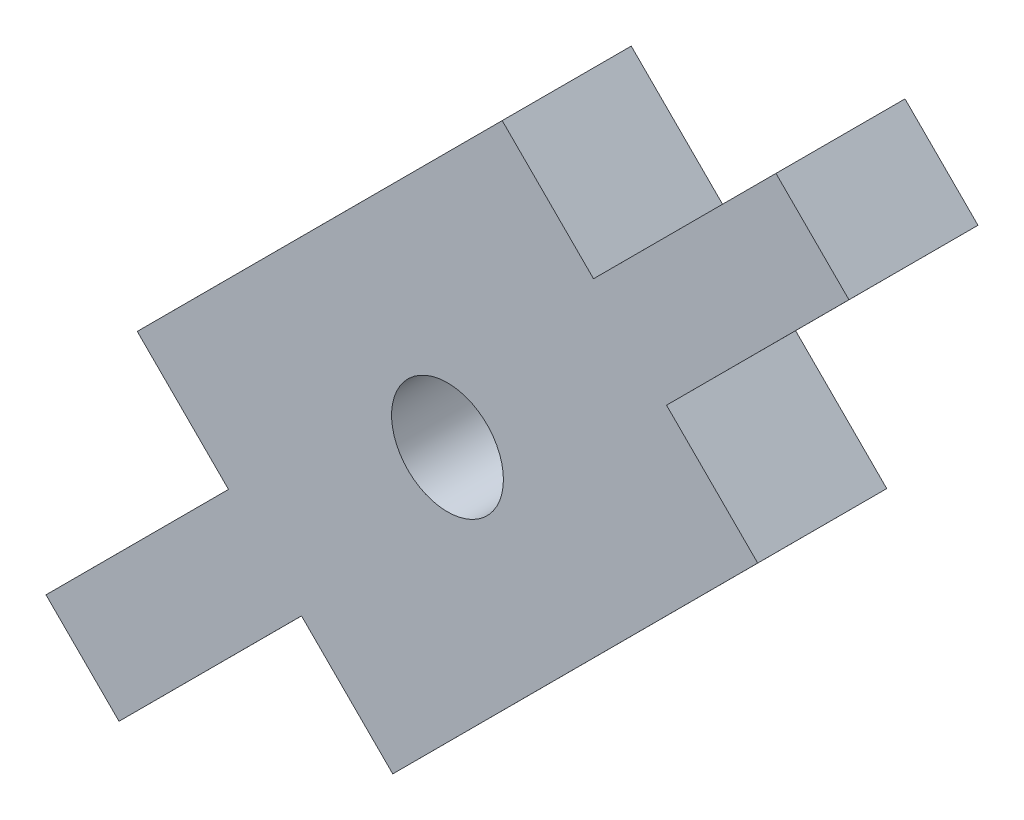
ISO-10303-21;
HEADER;
FILE_DESCRIPTION(('STEP AP214'),'2;1');
FILE_NAME('part.step','',(''),(''),'','','');
FILE_SCHEMA(('AUTOMOTIVE_DESIGN { 1 0 10303 214 1 1 1 1 }'));
ENDSEC;
DATA;
#1=APPLICATION_CONTEXT('core data for automotive mechanical design processes');
#2=APPLICATION_PROTOCOL_DEFINITION('international standard','automotive_design',2000,#1);
#3=PRODUCT_CONTEXT('',#1,'mechanical');
#4=PRODUCT('Part','Part','',(#3));
#5=PRODUCT_RELATED_PRODUCT_CATEGORY('part','',(#4));
#6=PRODUCT_DEFINITION_FORMATION('','',#4);
#7=PRODUCT_DEFINITION_CONTEXT('part definition',#1,'design');
#8=PRODUCT_DEFINITION('design','',#6,#7);
#9=PRODUCT_DEFINITION_SHAPE('','',#8);
#10=(LENGTH_UNIT() NAMED_UNIT(*) SI_UNIT(.MILLI.,.METRE.));
#11=(NAMED_UNIT(*) PLANE_ANGLE_UNIT() SI_UNIT($,.RADIAN.));
#12=(NAMED_UNIT(*) SI_UNIT($,.STERADIAN.) SOLID_ANGLE_UNIT());
#13=UNCERTAINTY_MEASURE_WITH_UNIT(LENGTH_MEASURE(1.E-05),#10,'distance_accuracy_value','');
#14=(GEOMETRIC_REPRESENTATION_CONTEXT(3) GLOBAL_UNCERTAINTY_ASSIGNED_CONTEXT((#13)) GLOBAL_UNIT_ASSIGNED_CONTEXT((#10,
#11,#12)) REPRESENTATION_CONTEXT('',''));
#15=CARTESIAN_POINT('',(0.,0.,0.));
#16=DIRECTION('',(0.,0.,1.));
#17=DIRECTION('',(1.,0.,0.));
#18=AXIS2_PLACEMENT_3D('',#15,#16,#17);
#19=CARTESIAN_POINT('',(11.1732462274372,31.927912313794,-3.36285766749983));
#20=DIRECTION('',(-0.707207961814516,0.707005586078468,0.));
#21=DIRECTION('',(-0.707005586078468,-0.707207961814516,0.));
#22=AXIS2_PLACEMENT_3D('',#19,#20,#21);
#23=PLANE('',#22);
#24=DIRECTION('',(-0.707005586078468,-0.707207961814516,0.));
#25=VECTOR('',#24,1.);
#26=CARTESIAN_POINT('',(11.1732462274372,31.927912313794,-0.36285766749983));
#27=LINE('',#26,#25);
#28=CARTESIAN_POINT('',(11.1732462274372,31.927912313794,-0.36285766749983));
#29=VERTEX_POINT('',#28);
#30=CARTESIAN_POINT('',(6.93196836559376,27.6854204138355,-0.36285766749983));
#31=VERTEX_POINT('',#30);
#32=EDGE_CURVE('E158',#29,#31,#27,.T.);
#33=ORIENTED_EDGE('',*,*,#32,.F.);
#34=DIRECTION('',(0.,0.,1.));
#35=VECTOR('',#34,1.);
#36=CARTESIAN_POINT('',(11.1732462274372,31.927912313794,-3.36285766749983));
#37=LINE('',#36,#35);
#38=CARTESIAN_POINT('',(11.1732462274372,31.927912313794,-3.36285766749983));
#39=VERTEX_POINT('',#38);
#40=EDGE_CURVE('E11',#39,#29,#37,.T.);
#41=ORIENTED_EDGE('',*,*,#40,.F.);
#42=DIRECTION('',(-0.707005586078468,-0.707207961814516,0.));
#43=VECTOR('',#42,1.);
#44=CARTESIAN_POINT('',(11.1732462274372,31.927912313794,-3.36285766749983));
#45=LINE('',#44,#43);
#46=CARTESIAN_POINT('',(6.93196836559376,27.6854204138355,-3.36285766749983));
#47=VERTEX_POINT('',#46);
#48=EDGE_CURVE('E191',#39,#47,#45,.T.);
#49=ORIENTED_EDGE('',*,*,#48,.T.);
#50=DIRECTION('',(0.,0.,1.));
#51=VECTOR('',#50,1.);
#52=CARTESIAN_POINT('',(6.93196836559376,27.6854204138355,-3.36285766749983));
#53=LINE('',#52,#51);
#54=EDGE_CURVE('E40',#47,#31,#53,.T.);
#55=ORIENTED_EDGE('',*,*,#54,.T.);
#56=EDGE_LOOP('',(#33,#41,#49,#55));
#57=FACE_BOUND('',#56,.T.);
#58=ADVANCED_FACE('F37',(#57),#23,.T.);
#59=CARTESIAN_POINT('',(12.8704287908278,30.2312154188192,-3.36285766749983));
#60=DIRECTION('',(0.707005586078475,0.707207961814509,0.));
#61=DIRECTION('',(-0.707207961814509,0.707005586078475,0.));
#62=AXIS2_PLACEMENT_3D('',#59,#60,#61);
#63=PLANE('',#62);
#64=DIRECTION('',(-0.707207961814509,0.707005586078475,0.));
#65=VECTOR('',#64,1.);
#66=CARTESIAN_POINT('',(12.8704287908278,30.2312154188192,-0.36285766749983));
#67=LINE('',#66,#65);
#68=CARTESIAN_POINT('',(12.8704287908278,30.2312154188192,-0.36285766749983));
#69=VERTEX_POINT('',#68);
#70=EDGE_CURVE('E189',#69,#29,#67,.T.);
#71=ORIENTED_EDGE('',*,*,#70,.F.);
#72=DIRECTION('',(0.,0.,1.));
#73=VECTOR('',#72,1.);
#74=CARTESIAN_POINT('',(12.8704287908278,30.2312154188192,-3.36285766749983));
#75=LINE('',#74,#73);
#76=CARTESIAN_POINT('',(12.8704287908278,30.2312154188192,-3.36285766749983));
#77=VERTEX_POINT('',#76);
#78=EDGE_CURVE('E46',#77,#69,#75,.T.);
#79=ORIENTED_EDGE('',*,*,#78,.F.);
#80=DIRECTION('',(-0.707207961814509,0.707005586078475,0.));
#81=VECTOR('',#80,1.);
#82=CARTESIAN_POINT('',(12.8704287908278,30.2312154188192,-3.36285766749983));
#83=LINE('',#82,#81);
#84=EDGE_CURVE('E148',#77,#39,#83,.T.);
#85=ORIENTED_EDGE('',*,*,#84,.T.);
#86=ORIENTED_EDGE('',*,*,#40,.T.);
#87=EDGE_LOOP('',(#71,#79,#85,#86));
#88=FACE_BOUND('',#87,.T.);
#89=ADVANCED_FACE('F211',(#88),#63,.T.);
#90=CARTESIAN_POINT('',(8.62908040068246,25.9886529703706,-3.36285766749983));
#91=DIRECTION('',(0.70720796181451,-0.707005586078474,0.));
#92=DIRECTION('',(0.707005586078474,0.70720796181451,0.));
#93=AXIS2_PLACEMENT_3D('',#90,#91,#92);
#94=PLANE('',#93);
#95=DIRECTION('',(0.707005586078474,0.70720796181451,0.));
#96=VECTOR('',#95,1.);
#97=CARTESIAN_POINT('',(8.62908040068246,25.9886529703706,-0.36285766749983));
#98=LINE('',#97,#96);
#99=CARTESIAN_POINT('',(8.62908040068246,25.9886529703706,-0.36285766749983));
#100=VERTEX_POINT('',#99);
#101=EDGE_CURVE('E135',#100,#69,#98,.T.);
#102=ORIENTED_EDGE('',*,*,#101,.F.);
#103=DIRECTION('',(0.,0.,1.));
#104=VECTOR('',#103,1.);
#105=CARTESIAN_POINT('',(8.62908040068246,25.9886529703706,-3.36285766749983));
#106=LINE('',#105,#104);
#107=CARTESIAN_POINT('',(8.62908040068246,25.9886529703706,-3.36285766749983));
#108=VERTEX_POINT('',#107);
#109=EDGE_CURVE('E130',#108,#100,#106,.T.);
#110=ORIENTED_EDGE('',*,*,#109,.F.);
#111=DIRECTION('',(0.707005586078474,0.70720796181451,0.));
#112=VECTOR('',#111,1.);
#113=CARTESIAN_POINT('',(8.62908040068246,25.9886529703706,-3.36285766749983));
#114=LINE('',#113,#112);
#115=EDGE_CURVE('E133',#108,#77,#114,.T.);
#116=ORIENTED_EDGE('',*,*,#115,.T.);
#117=ORIENTED_EDGE('',*,*,#78,.T.);
#118=EDGE_LOOP('',(#102,#110,#116,#117));
#119=FACE_BOUND('',#118,.T.);
#120=ADVANCED_FACE('F132',(#119),#94,.T.);
#121=CARTESIAN_POINT('',(10.7490725950828,23.869267436251,-3.36285766749983));
#122=DIRECTION('',(0.707005586078495,0.707207961814489,0.));
#123=DIRECTION('',(-0.707207961814489,0.707005586078495,0.));
#124=AXIS2_PLACEMENT_3D('',#121,#122,#123);
#125=PLANE('',#124);
#126=DIRECTION('',(-0.707207961814489,0.707005586078495,0.));
#127=VECTOR('',#126,1.);
#128=CARTESIAN_POINT('',(10.7490725950828,23.869267436251,-0.36285766749983));
#129=LINE('',#128,#127);
#130=CARTESIAN_POINT('',(10.7490725950828,23.869267436251,-0.36285766749983));
#131=VERTEX_POINT('',#130);
#132=EDGE_CURVE('E186',#131,#100,#129,.T.);
#133=ORIENTED_EDGE('',*,*,#132,.F.);
#134=DIRECTION('',(0.,0.,1.));
#135=VECTOR('',#134,1.);
#136=CARTESIAN_POINT('',(10.7490725950828,23.869267436251,-3.36285766749983));
#137=LINE('',#136,#135);
#138=CARTESIAN_POINT('',(10.7490725950828,23.869267436251,-3.36285766749983));
#139=VERTEX_POINT('',#138);
#140=EDGE_CURVE('E140',#139,#131,#137,.T.);
#141=ORIENTED_EDGE('',*,*,#140,.F.);
#142=DIRECTION('',(-0.707207961814489,0.707005586078495,0.));
#143=VECTOR('',#142,1.);
#144=CARTESIAN_POINT('',(10.7490725950828,23.869267436251,-3.36285766749983));
#145=LINE('',#144,#143);
#146=EDGE_CURVE('E146',#139,#108,#145,.T.);
#147=ORIENTED_EDGE('',*,*,#146,.T.);
#148=ORIENTED_EDGE('',*,*,#109,.T.);
#149=EDGE_LOOP('',(#133,#141,#147,#148));
#150=FACE_BOUND('',#149,.T.);
#151=ADVANCED_FACE('F150',(#150),#125,.T.);
#152=CARTESIAN_POINT('',(2.26429440441357,15.382060533185,-3.36285766749983));
#153=DIRECTION('',(0.707207961814509,-0.707005586078474,0.));
#154=DIRECTION('',(0.707005586078474,0.70720796181451,0.));
#155=AXIS2_PLACEMENT_3D('',#152,#153,#154);
#156=PLANE('',#155);
#157=DIRECTION('',(0.707005586078474,0.70720796181451,0.));
#158=VECTOR('',#157,1.);
#159=CARTESIAN_POINT('',(2.26429440441357,15.382060533185,-0.36285766749983));
#160=LINE('',#159,#158);
#161=CARTESIAN_POINT('',(2.26429440441357,15.382060533185,-0.36285766749983));
#162=VERTEX_POINT('',#161);
#163=EDGE_CURVE('E183',#162,#131,#160,.T.);
#164=ORIENTED_EDGE('',*,*,#163,.F.);
#165=DIRECTION('',(0.,0.,1.));
#166=VECTOR('',#165,1.);
#167=CARTESIAN_POINT('',(2.26429440441357,15.382060533185,-3.36285766749983));
#168=LINE('',#167,#166);
#169=CARTESIAN_POINT('',(2.26429440441357,15.382060533185,-3.36285766749983));
#170=VERTEX_POINT('',#169);
#171=EDGE_CURVE('E195',#170,#162,#168,.T.);
#172=ORIENTED_EDGE('',*,*,#171,.F.);
#173=DIRECTION('',(0.707005586078474,0.70720796181451,0.));
#174=VECTOR('',#173,1.);
#175=CARTESIAN_POINT('',(2.26429440441357,15.382060533185,-3.36285766749983));
#176=LINE('',#175,#174);
#177=EDGE_CURVE('E151',#170,#139,#176,.T.);
#178=ORIENTED_EDGE('',*,*,#177,.T.);
#179=ORIENTED_EDGE('',*,*,#140,.T.);
#180=EDGE_LOOP('',(#164,#172,#178,#179));
#181=FACE_BOUND('',#180,.T.);
#182=ADVANCED_FACE('F224',(#181),#156,.T.);
#183=CARTESIAN_POINT('',(0.142530427799192,17.5032173425026,-3.36285766749983));
#184=DIRECTION('',(-0.707005586078474,-0.70720796181451,0.));
#185=DIRECTION('',(0.70720796181451,-0.707005586078474,0.));
#186=AXIS2_PLACEMENT_3D('',#183,#184,#185);
#187=PLANE('',#186);
#188=DIRECTION('',(0.70720796181451,-0.707005586078474,0.));
#189=VECTOR('',#188,1.);
#190=CARTESIAN_POINT('',(0.142530427799192,17.5032173425026,-0.36285766749983));
#191=LINE('',#190,#189);
#192=CARTESIAN_POINT('',(0.142530427799192,17.5032173425026,-0.36285766749983));
#193=VERTEX_POINT('',#192);
#194=EDGE_CURVE('E180',#193,#162,#191,.T.);
#195=ORIENTED_EDGE('',*,*,#194,.F.);
#196=DIRECTION('',(0.,0.,1.));
#197=VECTOR('',#196,1.);
#198=CARTESIAN_POINT('',(0.142530427799192,17.5032173425026,-3.36285766749983));
#199=LINE('',#198,#197);
#200=CARTESIAN_POINT('',(0.142530427799192,17.5032173425026,-3.36285766749983));
#201=VERTEX_POINT('',#200);
#202=EDGE_CURVE('E197',#201,#193,#199,.T.);
#203=ORIENTED_EDGE('',*,*,#202,.F.);
#204=DIRECTION('',(0.70720796181451,-0.707005586078474,0.));
#205=VECTOR('',#204,1.);
#206=CARTESIAN_POINT('',(0.142530427799192,17.5032173425026,-3.36285766749983));
#207=LINE('',#206,#205);
#208=EDGE_CURVE('E153',#201,#170,#207,.T.);
#209=ORIENTED_EDGE('',*,*,#208,.T.);
#210=ORIENTED_EDGE('',*,*,#171,.T.);
#211=EDGE_LOOP('',(#195,#203,#209,#210));
#212=FACE_BOUND('',#211,.T.);
#213=ADVANCED_FACE('F227',(#212),#187,.T.);
#214=CARTESIAN_POINT('',(-4.09981959931743,13.2596529703707,-3.36285766749983));
#215=DIRECTION('',(0.707207961814509,-0.707005586078475,0.));
#216=DIRECTION('',(0.707005586078475,0.707207961814509,0.));
#217=AXIS2_PLACEMENT_3D('',#214,#215,#216);
#218=PLANE('',#217);
#219=DIRECTION('',(0.707005586078475,0.707207961814509,0.));
#220=VECTOR('',#219,1.);
#221=CARTESIAN_POINT('',(-4.09981959931743,13.2596529703707,-0.36285766749983));
#222=LINE('',#221,#220);
#223=CARTESIAN_POINT('',(-4.09981959931743,13.2596529703707,-0.36285766749983));
#224=VERTEX_POINT('',#223);
#225=EDGE_CURVE('E177',#224,#193,#222,.T.);
#226=ORIENTED_EDGE('',*,*,#225,.F.);
#227=DIRECTION('',(0.,0.,1.));
#228=VECTOR('',#227,1.);
#229=CARTESIAN_POINT('',(-4.09981959931743,13.2596529703707,-3.36285766749983));
#230=LINE('',#229,#228);
#231=CARTESIAN_POINT('',(-4.09981959931743,13.2596529703707,-3.36285766749983));
#232=VERTEX_POINT('',#231);
#233=EDGE_CURVE('E199',#232,#224,#230,.T.);
#234=ORIENTED_EDGE('',*,*,#233,.F.);
#235=DIRECTION('',(0.707005586078475,0.707207961814509,0.));
#236=VECTOR('',#235,1.);
#237=CARTESIAN_POINT('',(-4.09981959931743,13.2596529703707,-3.36285766749983));
#238=LINE('',#237,#236);
#239=EDGE_CURVE('E290',#232,#201,#238,.T.);
#240=ORIENTED_EDGE('',*,*,#239,.T.);
#241=ORIENTED_EDGE('',*,*,#202,.T.);
#242=EDGE_LOOP('',(#226,#234,#240,#241));
#243=FACE_BOUND('',#242,.T.);
#244=ADVANCED_FACE('F231',(#243),#218,.T.);
#245=CARTESIAN_POINT('',(-5.79750925647407,14.9568568140008,-3.36285766749983));
#246=DIRECTION('',(-0.707005586078475,-0.707207961814509,0.));
#247=DIRECTION('',(0.707207961814509,-0.707005586078475,0.));
#248=AXIS2_PLACEMENT_3D('',#245,#246,#247);
#249=PLANE('',#248);
#250=DIRECTION('',(0.707207961814509,-0.707005586078475,0.));
#251=VECTOR('',#250,1.);
#252=CARTESIAN_POINT('',(-5.79750925647407,14.9568568140008,-0.36285766749983));
#253=LINE('',#252,#251);
#254=CARTESIAN_POINT('',(-5.79750925647407,14.9568568140008,-0.36285766749983));
#255=VERTEX_POINT('',#254);
#256=EDGE_CURVE('E174',#255,#224,#253,.T.);
#257=ORIENTED_EDGE('',*,*,#256,.F.);
#258=DIRECTION('',(0.,0.,1.));
#259=VECTOR('',#258,1.);
#260=CARTESIAN_POINT('',(-5.79750925647407,14.9568568140008,-3.36285766749983));
#261=LINE('',#260,#259);
#262=CARTESIAN_POINT('',(-5.79750925647407,14.9568568140008,-3.36285766749983));
#263=VERTEX_POINT('',#262);
#264=EDGE_CURVE('E201',#263,#255,#261,.T.);
#265=ORIENTED_EDGE('',*,*,#264,.F.);
#266=DIRECTION('',(0.707207961814509,-0.707005586078475,0.));
#267=VECTOR('',#266,1.);
#268=CARTESIAN_POINT('',(-5.79750925647407,14.9568568140008,-3.36285766749983));
#269=LINE('',#268,#267);
#270=EDGE_CURVE('E287',#263,#232,#269,.T.);
#271=ORIENTED_EDGE('',*,*,#270,.T.);
#272=ORIENTED_EDGE('',*,*,#233,.T.);
#273=EDGE_LOOP('',(#257,#265,#271,#272));
#274=FACE_BOUND('',#273,.T.);
#275=ADVANCED_FACE('F235',(#274),#249,.T.);
#276=CARTESIAN_POINT('',(-1.55453239865857,19.2010481962578,-3.36285766749983));
#277=DIRECTION('',(-0.70720796181451,0.707005586078474,0.));
#278=DIRECTION('',(-0.707005586078474,-0.70720796181451,0.));
#279=AXIS2_PLACEMENT_3D('',#276,#277,#278);
#280=PLANE('',#279);
#281=DIRECTION('',(-0.707005586078474,-0.70720796181451,0.));
#282=VECTOR('',#281,1.);
#283=CARTESIAN_POINT('',(-1.55453239865857,19.2010481962578,-0.36285766749983));
#284=LINE('',#283,#282);
#285=CARTESIAN_POINT('',(-1.55453239865857,19.2010481962578,-0.36285766749983));
#286=VERTEX_POINT('',#285);
#287=EDGE_CURVE('E171',#286,#255,#284,.T.);
#288=ORIENTED_EDGE('',*,*,#287,.F.);
#289=DIRECTION('',(0.,0.,1.));
#290=VECTOR('',#289,1.);
#291=CARTESIAN_POINT('',(-1.55453239865857,19.2010481962578,-3.36285766749983));
#292=LINE('',#291,#290);
#293=CARTESIAN_POINT('',(-1.55453239865857,19.2010481962578,-3.36285766749983));
#294=VERTEX_POINT('',#293);
#295=EDGE_CURVE('E203',#294,#286,#292,.T.);
#296=ORIENTED_EDGE('',*,*,#295,.F.);
#297=DIRECTION('',(-0.707005586078474,-0.70720796181451,0.));
#298=VECTOR('',#297,1.);
#299=CARTESIAN_POINT('',(-1.55453239865857,19.2010481962578,-3.36285766749983));
#300=LINE('',#299,#298);
#301=EDGE_CURVE('E284',#294,#263,#300,.T.);
#302=ORIENTED_EDGE('',*,*,#301,.T.);
#303=ORIENTED_EDGE('',*,*,#264,.T.);
#304=EDGE_LOOP('',(#288,#296,#302,#303));
#305=FACE_BOUND('',#304,.T.);
#306=ADVANCED_FACE('F239',(#305),#280,.T.);
#307=CARTESIAN_POINT('',(-3.67577876488754,21.3216875433102,-3.36285766749983));
#308=DIRECTION('',(-0.707005586078475,-0.707207961814509,0.));
#309=DIRECTION('',(0.707207961814509,-0.707005586078475,0.));
#310=AXIS2_PLACEMENT_3D('',#307,#308,#309);
#311=PLANE('',#310);
#312=DIRECTION('',(0.707207961814509,-0.707005586078475,0.));
#313=VECTOR('',#312,1.);
#314=CARTESIAN_POINT('',(-3.67577876488754,21.3216875433102,-0.36285766749983));
#315=LINE('',#314,#313);
#316=CARTESIAN_POINT('',(-3.67577876488754,21.3216875433102,-0.36285766749983));
#317=VERTEX_POINT('',#316);
#318=EDGE_CURVE('E168',#317,#286,#315,.T.);
#319=ORIENTED_EDGE('',*,*,#318,.F.);
#320=DIRECTION('',(0.,0.,1.));
#321=VECTOR('',#320,1.);
#322=CARTESIAN_POINT('',(-3.67577876488754,21.3216875433102,-3.36285766749983));
#323=LINE('',#322,#321);
#324=CARTESIAN_POINT('',(-3.67577876488754,21.3216875433102,-3.36285766749983));
#325=VERTEX_POINT('',#324);
#326=EDGE_CURVE('E205',#325,#317,#323,.T.);
#327=ORIENTED_EDGE('',*,*,#326,.F.);
#328=DIRECTION('',(0.707207961814509,-0.707005586078475,0.));
#329=VECTOR('',#328,1.);
#330=CARTESIAN_POINT('',(-3.67577876488754,21.3216875433102,-3.36285766749983));
#331=LINE('',#330,#329);
#332=EDGE_CURVE('E281',#325,#294,#331,.T.);
#333=ORIENTED_EDGE('',*,*,#332,.T.);
#334=ORIENTED_EDGE('',*,*,#295,.T.);
#335=EDGE_LOOP('',(#319,#327,#333,#334));
#336=FACE_BOUND('',#335,.T.);
#337=ADVANCED_FACE('F243',(#336),#311,.T.);
#338=CARTESIAN_POINT('',(4.80844312338476,29.8083379847412,-3.36285766749983));
#339=DIRECTION('',(-0.707207961814509,0.707005586078475,0.));
#340=DIRECTION('',(-0.707005586078475,-0.707207961814509,0.));
#341=AXIS2_PLACEMENT_3D('',#338,#339,#340);
#342=PLANE('',#341);
#343=DIRECTION('',(-0.707005586078475,-0.707207961814509,0.));
#344=VECTOR('',#343,1.);
#345=CARTESIAN_POINT('',(4.80844312338476,29.8083379847412,-0.36285766749983));
#346=LINE('',#345,#344);
#347=CARTESIAN_POINT('',(4.80844312338476,29.8083379847412,-0.36285766749983));
#348=VERTEX_POINT('',#347);
#349=EDGE_CURVE('E165',#348,#317,#346,.T.);
#350=ORIENTED_EDGE('',*,*,#349,.F.);
#351=DIRECTION('',(0.,0.,1.));
#352=VECTOR('',#351,1.);
#353=CARTESIAN_POINT('',(4.80844312338476,29.8083379847412,-3.36285766749983));
#354=LINE('',#353,#352);
#355=CARTESIAN_POINT('',(4.80844312338476,29.8083379847412,-3.36285766749983));
#356=VERTEX_POINT('',#355);
#357=EDGE_CURVE('E206',#356,#348,#354,.T.);
#358=ORIENTED_EDGE('',*,*,#357,.F.);
#359=DIRECTION('',(-0.707005586078475,-0.707207961814509,0.));
#360=VECTOR('',#359,1.);
#361=CARTESIAN_POINT('',(4.80844312338476,29.8083379847412,-3.36285766749983));
#362=LINE('',#361,#360);
#363=EDGE_CURVE('E278',#356,#325,#362,.T.);
#364=ORIENTED_EDGE('',*,*,#363,.T.);
#365=ORIENTED_EDGE('',*,*,#326,.T.);
#366=EDGE_LOOP('',(#350,#358,#364,#365));
#367=FACE_BOUND('',#366,.T.);
#368=ADVANCED_FACE('F247',(#367),#342,.T.);
#369=CARTESIAN_POINT('',(6.93196836559376,27.6854204138355,-3.36285766749983));
#370=DIRECTION('',(0.707005586078475,0.707207961814509,0.));
#371=DIRECTION('',(-0.707207961814509,0.707005586078475,0.));
#372=AXIS2_PLACEMENT_3D('',#369,#370,#371);
#373=PLANE('',#372);
#374=DIRECTION('',(-0.707207961814509,0.707005586078475,0.));
#375=VECTOR('',#374,1.);
#376=CARTESIAN_POINT('',(6.93196836559376,27.6854204138355,-0.36285766749983));
#377=LINE('',#376,#375);
#378=EDGE_CURVE('E161',#31,#348,#377,.T.);
#379=ORIENTED_EDGE('',*,*,#378,.F.);
#380=ORIENTED_EDGE('',*,*,#54,.F.);
#381=DIRECTION('',(-0.707207961814509,0.707005586078475,0.));
#382=VECTOR('',#381,1.);
#383=CARTESIAN_POINT('',(6.93196836559376,27.6854204138355,-3.36285766749983));
#384=LINE('',#383,#382);
#385=EDGE_CURVE('E276',#47,#356,#384,.T.);
#386=ORIENTED_EDGE('',*,*,#385,.T.);
#387=ORIENTED_EDGE('',*,*,#357,.T.);
#388=EDGE_LOOP('',(#379,#380,#386,#387));
#389=FACE_BOUND('',#388,.T.);
#390=ADVANCED_FACE('F208',(#389),#373,.T.);
#391=CARTESIAN_POINT('',(0.,0.,-3.36285766749983));
#392=DIRECTION('',(0.,0.,-1.));
#393=DIRECTION('',(-1.,0.,0.));
#394=AXIS2_PLACEMENT_3D('',#391,#392,#393);
#395=PLANE('',#394);
#396=CARTESIAN_POINT('',(3.53656757422475,22.5939838241258,-3.36285766749983));
#397=DIRECTION('',(0.,0.,1.));
#398=DIRECTION('',(-1.,0.,0.));
#399=AXIS2_PLACEMENT_3D('',#396,#397,#398);
#400=CIRCLE('',#399,1.3);
#401=CARTESIAN_POINT('',(4.83656757422475,22.5939838241258,-3.36285766749983));
#402=VERTEX_POINT('',#401);
#403=EDGE_CURVE('E162',#402,#402,#400,.T.);
#404=ORIENTED_EDGE('',*,*,#403,.T.);
#405=EDGE_LOOP('',(#404));
#406=FACE_BOUND('',#405,.T.);
#407=ORIENTED_EDGE('',*,*,#48,.F.);
#408=ORIENTED_EDGE('',*,*,#84,.F.);
#409=ORIENTED_EDGE('',*,*,#115,.F.);
#410=ORIENTED_EDGE('',*,*,#146,.F.);
#411=ORIENTED_EDGE('',*,*,#177,.F.);
#412=ORIENTED_EDGE('',*,*,#208,.F.);
#413=ORIENTED_EDGE('',*,*,#239,.F.);
#414=ORIENTED_EDGE('',*,*,#270,.F.);
#415=ORIENTED_EDGE('',*,*,#301,.F.);
#416=ORIENTED_EDGE('',*,*,#332,.F.);
#417=ORIENTED_EDGE('',*,*,#363,.F.);
#418=ORIENTED_EDGE('',*,*,#385,.F.);
#419=EDGE_LOOP('',(#407,#408,#409,#410,#411,#412,#413,#414,#415,#416,#417,#418));
#420=FACE_BOUND('',#419,.T.);
#421=ADVANCED_FACE('F144',(#406,#420),#395,.T.);
#422=CARTESIAN_POINT('',(0.,0.,-0.36285766749983));
#423=DIRECTION('',(0.,0.,-1.));
#424=DIRECTION('',(-1.,0.,0.));
#425=AXIS2_PLACEMENT_3D('',#422,#423,#424);
#426=PLANE('',#425);
#427=CARTESIAN_POINT('',(3.53656757422475,22.5939838241258,-0.36285766749983));
#428=DIRECTION('',(0.,0.,1.));
#429=DIRECTION('',(-1.,0.,0.));
#430=AXIS2_PLACEMENT_3D('',#427,#428,#429);
#431=CIRCLE('',#430,1.3);
#432=CARTESIAN_POINT('',(4.83656757422475,22.5939838241258,-0.36285766749983));
#433=VERTEX_POINT('',#432);
#434=EDGE_CURVE('E271',#433,#433,#431,.T.);
#435=ORIENTED_EDGE('',*,*,#434,.F.);
#436=EDGE_LOOP('',(#435));
#437=FACE_BOUND('',#436,.T.);
#438=ORIENTED_EDGE('',*,*,#32,.T.);
#439=ORIENTED_EDGE('',*,*,#378,.T.);
#440=ORIENTED_EDGE('',*,*,#349,.T.);
#441=ORIENTED_EDGE('',*,*,#318,.T.);
#442=ORIENTED_EDGE('',*,*,#287,.T.);
#443=ORIENTED_EDGE('',*,*,#256,.T.);
#444=ORIENTED_EDGE('',*,*,#225,.T.);
#445=ORIENTED_EDGE('',*,*,#194,.T.);
#446=ORIENTED_EDGE('',*,*,#163,.T.);
#447=ORIENTED_EDGE('',*,*,#132,.T.);
#448=ORIENTED_EDGE('',*,*,#101,.T.);
#449=ORIENTED_EDGE('',*,*,#70,.T.);
#450=EDGE_LOOP('',(#438,#439,#440,#441,#442,#443,#444,#445,#446,#447,#448,#449));
#451=FACE_BOUND('',#450,.T.);
#452=ADVANCED_FACE('F210',(#437,#451),#426,.F.);
#453=CARTESIAN_POINT('',(3.53656757422475,22.5939838241258,-3.36285766749983));
#454=DIRECTION('',(0.,0.,1.));
#455=DIRECTION('',(1.,0.,0.));
#456=AXIS2_PLACEMENT_3D('',#453,#454,#455);
#457=CYLINDRICAL_SURFACE('',#456,1.3);
#458=CARTESIAN_POINT('',(4.83656757422475,22.5939838241258,-3.36285766749983));
#459=CARTESIAN_POINT('',(4.83656757422475,22.5939838241258,-3.33160766749983));
#460=CARTESIAN_POINT('',(4.83656757422475,22.5939838241258,-3.30035766749983));
#461=CARTESIAN_POINT('',(4.83656757422475,22.5939838241258,-3.23785766749983));
#462=CARTESIAN_POINT('',(4.83656757422475,22.5939838241258,-3.20660766749983));
#463=CARTESIAN_POINT('',(4.83656757422475,22.5939838241258,-3.14410766749983));
#464=CARTESIAN_POINT('',(4.83656757422475,22.5939838241258,-3.11285766749983));
#465=CARTESIAN_POINT('',(4.83656757422475,22.5939838241258,-3.05035766749983));
#466=CARTESIAN_POINT('',(4.83656757422475,22.5939838241258,-3.01910766749983));
#467=CARTESIAN_POINT('',(4.83656757422475,22.5939838241258,-2.95660766749983));
#468=CARTESIAN_POINT('',(4.83656757422475,22.5939838241258,-2.92535766749983));
#469=CARTESIAN_POINT('',(4.83656757422475,22.5939838241258,-2.86285766749983));
#470=CARTESIAN_POINT('',(4.83656757422475,22.5939838241258,-2.83160766749983));
#471=CARTESIAN_POINT('',(4.83656757422475,22.5939838241258,-2.76910766749983));
#472=CARTESIAN_POINT('',(4.83656757422475,22.5939838241258,-2.73785766749983));
#473=CARTESIAN_POINT('',(4.83656757422475,22.5939838241258,-2.67535766749983));
#474=CARTESIAN_POINT('',(4.83656757422475,22.5939838241258,-2.64410766749983));
#475=CARTESIAN_POINT('',(4.83656757422475,22.5939838241258,-2.58160766749983));
#476=CARTESIAN_POINT('',(4.83656757422475,22.5939838241258,-2.55035766749983));
#477=CARTESIAN_POINT('',(4.83656757422475,22.5939838241258,-2.48785766749983));
#478=CARTESIAN_POINT('',(4.83656757422475,22.5939838241258,-2.45660766749983));
#479=CARTESIAN_POINT('',(4.83656757422475,22.5939838241258,-2.39410766749983));
#480=CARTESIAN_POINT('',(4.83656757422475,22.5939838241258,-2.36285766749983));
#481=CARTESIAN_POINT('',(4.83656757422475,22.5939838241258,-2.30035766749983));
#482=CARTESIAN_POINT('',(4.83656757422475,22.5939838241258,-2.26910766749983));
#483=CARTESIAN_POINT('',(4.83656757422475,22.5939838241258,-2.20660766749983));
#484=CARTESIAN_POINT('',(4.83656757422475,22.5939838241258,-2.17535766749983));
#485=CARTESIAN_POINT('',(4.83656757422475,22.5939838241258,-2.11285766749983));
#486=CARTESIAN_POINT('',(4.83656757422475,22.5939838241258,-2.08160766749983));
#487=CARTESIAN_POINT('',(4.83656757422475,22.5939838241258,-2.01910766749983));
#488=CARTESIAN_POINT('',(4.83656757422475,22.5939838241258,-1.98785766749983));
#489=CARTESIAN_POINT('',(4.83656757422475,22.5939838241258,-1.92535766749983));
#490=CARTESIAN_POINT('',(4.83656757422475,22.5939838241258,-1.89410766749983));
#491=CARTESIAN_POINT('',(4.83656757422475,22.5939838241258,-1.83160766749983));
#492=CARTESIAN_POINT('',(4.83656757422475,22.5939838241258,-1.80035766749983));
#493=CARTESIAN_POINT('',(4.83656757422475,22.5939838241258,-1.73785766749983));
#494=CARTESIAN_POINT('',(4.83656757422475,22.5939838241258,-1.70660766749983));
#495=CARTESIAN_POINT('',(4.83656757422475,22.5939838241258,-1.64410766749983));
#496=CARTESIAN_POINT('',(4.83656757422475,22.5939838241258,-1.61285766749983));
#497=CARTESIAN_POINT('',(4.83656757422475,22.5939838241258,-1.55035766749983));
#498=CARTESIAN_POINT('',(4.83656757422475,22.5939838241258,-1.51910766749983));
#499=CARTESIAN_POINT('',(4.83656757422475,22.5939838241258,-1.45660766749983));
#500=CARTESIAN_POINT('',(4.83656757422475,22.5939838241258,-1.42535766749983));
#501=CARTESIAN_POINT('',(4.83656757422475,22.5939838241258,-1.36285766749983));
#502=CARTESIAN_POINT('',(4.83656757422475,22.5939838241258,-1.33160766749983));
#503=CARTESIAN_POINT('',(4.83656757422475,22.5939838241258,-1.26910766749983));
#504=CARTESIAN_POINT('',(4.83656757422475,22.5939838241258,-1.23785766749983));
#505=CARTESIAN_POINT('',(4.83656757422475,22.5939838241258,-1.17535766749983));
#506=CARTESIAN_POINT('',(4.83656757422475,22.5939838241258,-1.14410766749983));
#507=CARTESIAN_POINT('',(4.83656757422475,22.5939838241258,-1.08160766749983));
#508=CARTESIAN_POINT('',(4.83656757422475,22.5939838241258,-1.05035766749983));
#509=CARTESIAN_POINT('',(4.83656757422475,22.5939838241258,-0.98785766749983));
#510=CARTESIAN_POINT('',(4.83656757422475,22.5939838241258,-0.95660766749983));
#511=CARTESIAN_POINT('',(4.83656757422475,22.5939838241258,-0.89410766749983));
#512=CARTESIAN_POINT('',(4.83656757422475,22.5939838241258,-0.86285766749983));
#513=CARTESIAN_POINT('',(4.83656757422475,22.5939838241258,-0.80035766749983));
#514=CARTESIAN_POINT('',(4.83656757422475,22.5939838241258,-0.76910766749983));
#515=CARTESIAN_POINT('',(4.83656757422475,22.5939838241258,-0.70660766749983));
#516=CARTESIAN_POINT('',(4.83656757422475,22.5939838241258,-0.67535766749983));
#517=CARTESIAN_POINT('',(4.83656757422475,22.5939838241258,-0.61285766749983));
#518=CARTESIAN_POINT('',(4.83656757422475,22.5939838241258,-0.58160766749983));
#519=CARTESIAN_POINT('',(4.83656757422475,22.5939838241258,-0.51910766749983));
#520=CARTESIAN_POINT('',(4.83656757422475,22.5939838241258,-0.48785766749983));
#521=CARTESIAN_POINT('',(4.83656757422475,22.5939838241258,-0.42535766749983));
#522=CARTESIAN_POINT('',(4.83656757422475,22.5939838241258,-0.39410766749983));
#523=CARTESIAN_POINT('',(4.83656757422475,22.5939838241258,-0.36285766749983));
#524=B_SPLINE_CURVE_WITH_KNOTS('',3,(#458,#459,#460,#461,#462,#463,#464,#465,#466,#467,#468,
#469,#470,#471,#472,#473,#474,#475,#476,#477,#478,#479,#480,#481,#482,#483,#484,#485,#486,#487,
#488,#489,#490,#491,#492,#493,#494,#495,#496,#497,#498,#499,#500,#501,#502,#503,#504,#505,#506,
#507,#508,#509,#510,#511,#512,#513,#514,#515,#516,#517,#518,#519,#520,#521,#522,#523),
.UNSPECIFIED.,.F.,.F.,(4,2,2,2,2,2,2,2,2,2,2,2,2,2,2,2,2,2,2,2,2,2,2,2,2,2,2,2,2,2,2,2,4),(0.,
0.0937500000000001,0.1875,0.28125,0.375,0.46875,0.5625,0.656250000000001,0.750000000000001,
0.843750000000001,0.9375,1.03125,1.125,1.21875,1.3125,1.40625,1.5,1.59375,1.6875,1.78125,1.875,
1.96875,2.0625,2.15625,2.25,2.34375,2.4375,2.53125,2.625,2.71875,2.8125,2.90625,3.),.UNSPECIFIED.);
#525=EDGE_CURVE('BSEAM259',#402,#433,#524,.T.);
#526=ORIENTED_EDGE('',*,*,#403,.F.);
#527=ORIENTED_EDGE('',*,*,#434,.T.);
#528=ORIENTED_EDGE('',*,*,#525,.T.);
#529=ORIENTED_EDGE('',*,*,#525,.F.);
#530=EDGE_LOOP('',(#526,#528,#527,#529));
#531=FACE_BOUND('',#530,.T.);
#532=ADVANCED_FACE('F259',(#531),#457,.F.);
#533=CLOSED_SHELL('',(#58,#89,#120,#151,#182,#213,#244,#275,#306,#337,#368,#390,#421,#452,#532));
#534=MANIFOLD_SOLID_BREP('B2',#533);
#535=ADVANCED_BREP_SHAPE_REPRESENTATION('',(#18,#534),#14);
#536=SHAPE_DEFINITION_REPRESENTATION(#9,#535);
ENDSEC;
END-ISO-10303-21;
